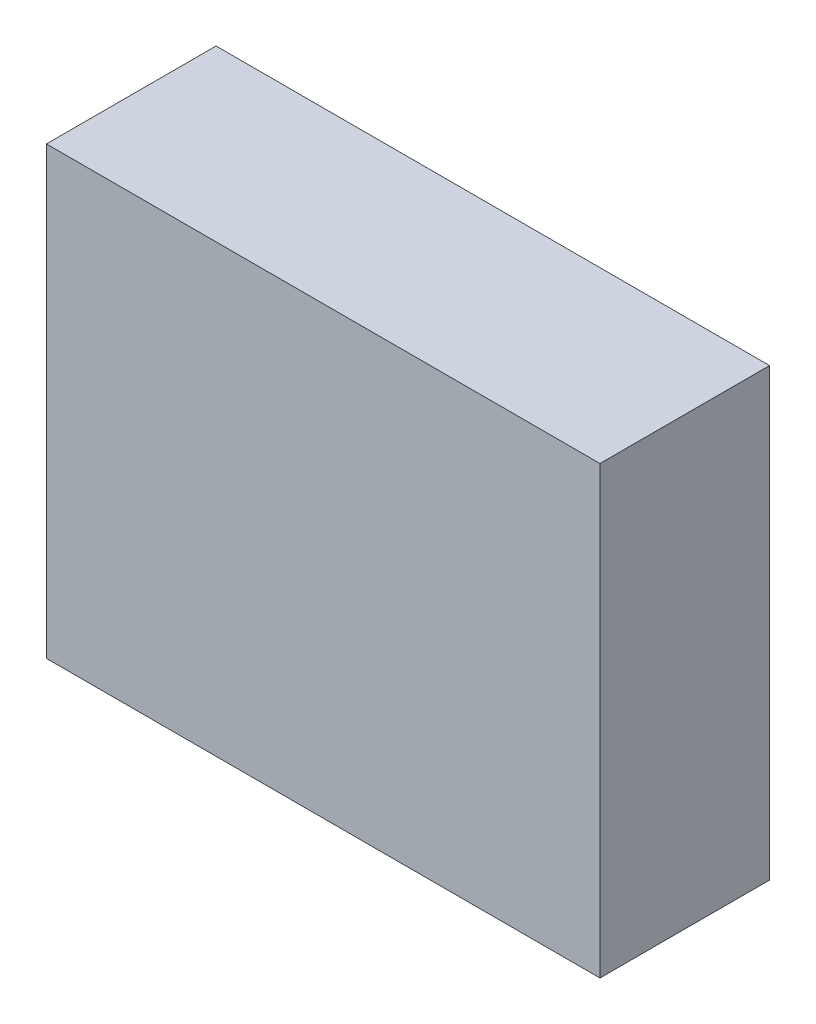
ISO-10303-21;
HEADER;
FILE_DESCRIPTION(('STEP AP214'),'2;1');
FILE_NAME('part.step','',(''),(''),'','','');
FILE_SCHEMA(('AUTOMOTIVE_DESIGN { 1 0 10303 214 1 1 1 1 }'));
ENDSEC;
DATA;
#1=APPLICATION_CONTEXT('core data for automotive mechanical design processes');
#2=APPLICATION_PROTOCOL_DEFINITION('international standard','automotive_design',2000,#1);
#3=PRODUCT_CONTEXT('',#1,'mechanical');
#4=PRODUCT('Part','Part','',(#3));
#5=PRODUCT_RELATED_PRODUCT_CATEGORY('part','',(#4));
#6=PRODUCT_DEFINITION_FORMATION('','',#4);
#7=PRODUCT_DEFINITION_CONTEXT('part definition',#1,'design');
#8=PRODUCT_DEFINITION('design','',#6,#7);
#9=PRODUCT_DEFINITION_SHAPE('','',#8);
#10=(LENGTH_UNIT() NAMED_UNIT(*) SI_UNIT(.MILLI.,.METRE.));
#11=(NAMED_UNIT(*) PLANE_ANGLE_UNIT() SI_UNIT($,.RADIAN.));
#12=(NAMED_UNIT(*) SI_UNIT($,.STERADIAN.) SOLID_ANGLE_UNIT());
#13=UNCERTAINTY_MEASURE_WITH_UNIT(LENGTH_MEASURE(1.E-05),#10,'distance_accuracy_value','');
#14=(GEOMETRIC_REPRESENTATION_CONTEXT(3) GLOBAL_UNCERTAINTY_ASSIGNED_CONTEXT((#13)) GLOBAL_UNIT_ASSIGNED_CONTEXT((#10,
#11,#12)) REPRESENTATION_CONTEXT('',''));
#15=CARTESIAN_POINT('',(0.,0.,0.));
#16=DIRECTION('',(0.,0.,1.));
#17=DIRECTION('',(1.,0.,0.));
#18=AXIS2_PLACEMENT_3D('',#15,#16,#17);
#19=CARTESIAN_POINT('',(-1.6635,-1.3135,1.));
#20=DIRECTION('',(1.,0.,0.));
#21=DIRECTION('',(0.,0.,-1.));
#22=AXIS2_PLACEMENT_3D('',#19,#20,#21);
#23=PLANE('',#22);
#24=DIRECTION('',(0.,-1.,0.));
#25=VECTOR('',#24,1.);
#26=CARTESIAN_POINT('',(-1.6635,-1.3135,0.));
#27=LINE('',#26,#25);
#28=CARTESIAN_POINT('',(-1.6635,1.3135,0.));
#29=VERTEX_POINT('',#28);
#30=CARTESIAN_POINT('',(-1.6635,-1.3135,0.));
#31=VERTEX_POINT('',#30);
#32=EDGE_CURVE('E95',#29,#31,#27,.T.);
#33=ORIENTED_EDGE('',*,*,#32,.T.);
#34=DIRECTION('',(0.,0.,-1.));
#35=VECTOR('',#34,1.);
#36=CARTESIAN_POINT('',(-1.6635,-1.3135,1.));
#37=LINE('',#36,#35);
#38=CARTESIAN_POINT('',(-1.6635,-1.3135,1.));
#39=VERTEX_POINT('',#38);
#40=EDGE_CURVE('E11',#39,#31,#37,.T.);
#41=ORIENTED_EDGE('',*,*,#40,.F.);
#42=DIRECTION('',(0.,-1.,0.));
#43=VECTOR('',#42,1.);
#44=CARTESIAN_POINT('',(-1.6635,-1.3135,1.));
#45=LINE('',#44,#43);
#46=CARTESIAN_POINT('',(-1.6635,1.3135,1.));
#47=VERTEX_POINT('',#46);
#48=EDGE_CURVE('E83',#47,#39,#45,.T.);
#49=ORIENTED_EDGE('',*,*,#48,.F.);
#50=DIRECTION('',(0.,0.,-1.));
#51=VECTOR('',#50,1.);
#52=CARTESIAN_POINT('',(-1.6635,1.3135,1.));
#53=LINE('',#52,#51);
#54=EDGE_CURVE('E91',#47,#29,#53,.T.);
#55=ORIENTED_EDGE('',*,*,#54,.T.);
#56=EDGE_LOOP('',(#33,#41,#49,#55));
#57=FACE_BOUND('',#56,.T.);
#58=ADVANCED_FACE('F32',(#57),#23,.F.);
#59=CARTESIAN_POINT('',(1.6,-1.3135,1.));
#60=DIRECTION('',(0.,1.,0.));
#61=DIRECTION('',(0.,0.,1.));
#62=AXIS2_PLACEMENT_3D('',#59,#60,#61);
#63=PLANE('',#62);
#64=DIRECTION('',(1.,0.,0.));
#65=VECTOR('',#64,1.);
#66=CARTESIAN_POINT('',(1.6,-1.3135,0.));
#67=LINE('',#66,#65);
#68=CARTESIAN_POINT('',(1.6,-1.3135,0.));
#69=VERTEX_POINT('',#68);
#70=EDGE_CURVE('E87',#31,#69,#67,.T.);
#71=ORIENTED_EDGE('',*,*,#70,.T.);
#72=DIRECTION('',(0.,0.,-1.));
#73=VECTOR('',#72,1.);
#74=CARTESIAN_POINT('',(1.6,-1.3135,1.));
#75=LINE('',#74,#73);
#76=CARTESIAN_POINT('',(1.6,-1.3135,1.));
#77=VERTEX_POINT('',#76);
#78=EDGE_CURVE('E40',#77,#69,#75,.T.);
#79=ORIENTED_EDGE('',*,*,#78,.F.);
#80=DIRECTION('',(1.,0.,0.));
#81=VECTOR('',#80,1.);
#82=CARTESIAN_POINT('',(1.6,-1.3135,1.));
#83=LINE('',#82,#81);
#84=EDGE_CURVE('E78',#39,#77,#83,.T.);
#85=ORIENTED_EDGE('',*,*,#84,.F.);
#86=ORIENTED_EDGE('',*,*,#40,.T.);
#87=EDGE_LOOP('',(#71,#79,#85,#86));
#88=FACE_BOUND('',#87,.T.);
#89=ADVANCED_FACE('F86',(#88),#63,.F.);
#90=CARTESIAN_POINT('',(1.6,1.3135,1.));
#91=DIRECTION('',(-1.,0.,0.));
#92=DIRECTION('',(0.,0.,1.));
#93=AXIS2_PLACEMENT_3D('',#90,#91,#92);
#94=PLANE('',#93);
#95=DIRECTION('',(0.,1.,0.));
#96=VECTOR('',#95,1.);
#97=CARTESIAN_POINT('',(1.6,1.3135,0.));
#98=LINE('',#97,#96);
#99=CARTESIAN_POINT('',(1.6,1.3135,0.));
#100=VERTEX_POINT('',#99);
#101=EDGE_CURVE('E65',#69,#100,#98,.T.);
#102=ORIENTED_EDGE('',*,*,#101,.T.);
#103=DIRECTION('',(0.,0.,-1.));
#104=VECTOR('',#103,1.);
#105=CARTESIAN_POINT('',(1.6,1.3135,1.));
#106=LINE('',#105,#104);
#107=CARTESIAN_POINT('',(1.6,1.3135,1.));
#108=VERTEX_POINT('',#107);
#109=EDGE_CURVE('E88',#108,#100,#106,.T.);
#110=ORIENTED_EDGE('',*,*,#109,.F.);
#111=DIRECTION('',(0.,1.,0.));
#112=VECTOR('',#111,1.);
#113=CARTESIAN_POINT('',(1.6,1.3135,1.));
#114=LINE('',#113,#112);
#115=EDGE_CURVE('E81',#77,#108,#114,.T.);
#116=ORIENTED_EDGE('',*,*,#115,.F.);
#117=ORIENTED_EDGE('',*,*,#78,.T.);
#118=EDGE_LOOP('',(#102,#110,#116,#117));
#119=FACE_BOUND('',#118,.T.);
#120=ADVANCED_FACE('F89',(#119),#94,.F.);
#121=CARTESIAN_POINT('',(-1.6635,1.3135,1.));
#122=DIRECTION('',(0.,-1.,0.));
#123=DIRECTION('',(0.,0.,-1.));
#124=AXIS2_PLACEMENT_3D('',#121,#122,#123);
#125=PLANE('',#124);
#126=DIRECTION('',(-1.,0.,0.));
#127=VECTOR('',#126,1.);
#128=CARTESIAN_POINT('',(-1.6635,1.3135,0.));
#129=LINE('',#128,#127);
#130=EDGE_CURVE('E71',#100,#29,#129,.T.);
#131=ORIENTED_EDGE('',*,*,#130,.T.);
#132=ORIENTED_EDGE('',*,*,#54,.F.);
#133=DIRECTION('',(-1.,0.,0.));
#134=VECTOR('',#133,1.);
#135=CARTESIAN_POINT('',(-1.6635,1.3135,1.));
#136=LINE('',#135,#134);
#137=EDGE_CURVE('E48',#108,#47,#136,.T.);
#138=ORIENTED_EDGE('',*,*,#137,.F.);
#139=ORIENTED_EDGE('',*,*,#109,.T.);
#140=EDGE_LOOP('',(#131,#132,#138,#139));
#141=FACE_BOUND('',#140,.T.);
#142=ADVANCED_FACE('F102',(#141),#125,.F.);
#143=CARTESIAN_POINT('',(0.,0.,1.));
#144=DIRECTION('',(0.,0.,-1.));
#145=DIRECTION('',(-1.,0.,0.));
#146=AXIS2_PLACEMENT_3D('',#143,#144,#145);
#147=PLANE('',#146);
#148=ORIENTED_EDGE('',*,*,#48,.T.);
#149=ORIENTED_EDGE('',*,*,#84,.T.);
#150=ORIENTED_EDGE('',*,*,#115,.T.);
#151=ORIENTED_EDGE('',*,*,#137,.T.);
#152=EDGE_LOOP('',(#148,#149,#150,#151));
#153=FACE_BOUND('',#152,.T.);
#154=ADVANCED_FACE('F79',(#153),#147,.F.);
#155=CARTESIAN_POINT('',(0.,0.,0.));
#156=DIRECTION('',(0.,0.,-1.));
#157=DIRECTION('',(-1.,0.,0.));
#158=AXIS2_PLACEMENT_3D('',#155,#156,#157);
#159=PLANE('',#158);
#160=ORIENTED_EDGE('',*,*,#32,.F.);
#161=ORIENTED_EDGE('',*,*,#130,.F.);
#162=ORIENTED_EDGE('',*,*,#101,.F.);
#163=ORIENTED_EDGE('',*,*,#70,.F.);
#164=EDGE_LOOP('',(#160,#161,#162,#163));
#165=FACE_BOUND('',#164,.T.);
#166=ADVANCED_FACE('F105',(#165),#159,.T.);
#167=CLOSED_SHELL('',(#58,#89,#120,#142,#154,#166));
#168=MANIFOLD_SOLID_BREP('B2',#167);
#169=ADVANCED_BREP_SHAPE_REPRESENTATION('',(#18,#168),#14);
#170=SHAPE_DEFINITION_REPRESENTATION(#9,#169);
ENDSEC;
END-ISO-10303-21;
